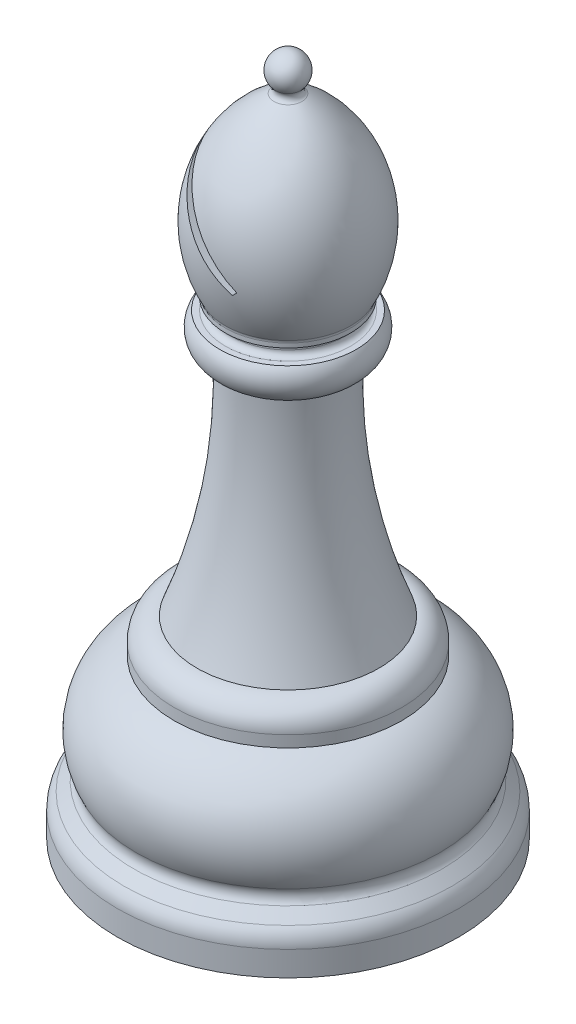
ISO-10303-21;
HEADER;
FILE_DESCRIPTION(('STEP AP214'),'2;1');
FILE_NAME('part.step','',(''),(''),'','','');
FILE_SCHEMA(('AUTOMOTIVE_DESIGN { 1 0 10303 214 1 1 1 1 }'));
ENDSEC;
DATA;
#1=APPLICATION_CONTEXT('core data for automotive mechanical design processes');
#2=APPLICATION_PROTOCOL_DEFINITION('international standard','automotive_design',2000,#1);
#3=PRODUCT_CONTEXT('',#1,'mechanical');
#4=PRODUCT('Part','Part','',(#3));
#5=PRODUCT_RELATED_PRODUCT_CATEGORY('part','',(#4));
#6=PRODUCT_DEFINITION_FORMATION('','',#4);
#7=PRODUCT_DEFINITION_CONTEXT('part definition',#1,'design');
#8=PRODUCT_DEFINITION('design','',#6,#7);
#9=PRODUCT_DEFINITION_SHAPE('','',#8);
#10=(LENGTH_UNIT() NAMED_UNIT(*) SI_UNIT(.MILLI.,.METRE.));
#11=(NAMED_UNIT(*) PLANE_ANGLE_UNIT() SI_UNIT($,.RADIAN.));
#12=(NAMED_UNIT(*) SI_UNIT($,.STERADIAN.) SOLID_ANGLE_UNIT());
#13=UNCERTAINTY_MEASURE_WITH_UNIT(LENGTH_MEASURE(1.E-05),#10,'distance_accuracy_value','');
#14=(GEOMETRIC_REPRESENTATION_CONTEXT(3) GLOBAL_UNCERTAINTY_ASSIGNED_CONTEXT((#13)) GLOBAL_UNIT_ASSIGNED_CONTEXT((#10,
#11,#12)) REPRESENTATION_CONTEXT('',''));
#15=CARTESIAN_POINT('',(0.,0.,0.));
#16=DIRECTION('',(0.,0.,1.));
#17=DIRECTION('',(1.,0.,0.));
#18=AXIS2_PLACEMENT_3D('',#15,#16,#17);
#19=CARTESIAN_POINT('',(0.,47.0339362469062,0.));
#20=DIRECTION('',(0.,1.,0.));
#21=DIRECTION('',(-1.,0.,0.));
#22=AXIS2_PLACEMENT_3D('',#19,#20,#21);
#23=DEGENERATE_TOROIDAL_SURFACE('',#22,4.34048728023934,11.1788608374825,.F.);
#24=CARTESIAN_POINT('',(0.,56.7241639655414,0.));
#25=DIRECTION('',(0.,-1.,0.));
#26=DIRECTION('',(1.,0.,0.));
#27=AXIS2_PLACEMENT_3D('',#24,#25,#26);
#28=CIRCLE('',#27,1.23323825882282);
#29=CARTESIAN_POINT('',(1.23323825882276,56.7241639655414,0.));
#30=VERTEX_POINT('',#29);
#31=EDGE_CURVE('E171',#30,#30,#28,.T.);
#32=ORIENTED_EDGE('',*,*,#31,.T.);
#33=EDGE_LOOP('',(#32));
#34=FACE_BOUND('',#33,.T.);
#35=CARTESIAN_POINT('',(0.,41.8377109987457,0.));
#36=DIRECTION('',(0.,1.,0.));
#37=DIRECTION('',(-1.,0.,0.));
#38=AXIS2_PLACEMENT_3D('',#35,#36,#37);
#39=CIRCLE('',#38,5.55729897700933);
#40=CARTESIAN_POINT('',(-5.55729897700938,41.8377109987457,0.));
#41=VERTEX_POINT('',#40);
#42=EDGE_CURVE('E174',#41,#41,#39,.T.);
#43=ORIENTED_EDGE('',*,*,#42,.T.);
#44=EDGE_LOOP('',(#43));
#45=FACE_BOUND('',#44,.T.);
#46=CARTESIAN_POINT('',(1.64275083167959,45.4222859188392,-6.51775398240126));
#47=CARTESIAN_POINT('',(1.54350520382158,45.4913393907475,-6.55314277290175));
#48=CARTESIAN_POINT('',(1.44402714878169,45.5615428418492,-6.58555057673839));
#49=CARTESIAN_POINT('',(1.24487757671969,45.7041255907972,-6.64440803459074));
#50=CARTESIAN_POINT('',(1.14520607249003,45.7765047490653,-6.67085806989428));
#51=CARTESIAN_POINT('',(0.84642782291826,45.9966310719432,-6.74125084270058));
#52=CARTESIAN_POINT('',(0.647418630164408,46.1474634190554,-6.77628542334018));
#53=CARTESIAN_POINT('',(0.252909735578571,46.455232765128,-6.82263017668789));
#54=CARTESIAN_POINT('',(0.0573982346028076,46.6121390804039,-6.83404689644883));
#55=CARTESIAN_POINT('',(-0.329183470627615,46.9313162457269,-6.83384712499839));
#56=CARTESIAN_POINT('',(-0.520253875207811,47.0935868530027,-6.82223167475218));
#57=CARTESIAN_POINT('',(-0.870185886394232,47.399165206761,-6.77963094117064));
#58=CARTESIAN_POINT('',(-1.0298399822959,47.5419824957957,-6.75155474925886));
#59=CARTESIAN_POINT('',(-1.34375580040717,47.8294774316792,-6.67902564902212));
#60=CARTESIAN_POINT('',(-1.49801589094728,47.9741556236489,-6.63456783143573));
#61=CARTESIAN_POINT('',(-1.80028731528978,48.2642495698228,-6.52966318444163));
#62=CARTESIAN_POINT('',(-1.94829831784272,48.4096653626689,-6.46921550867996));
#63=CARTESIAN_POINT('',(-2.23741334650427,48.7001454460949,-6.33271778315066));
#64=CARTESIAN_POINT('',(-2.37851494282877,48.8452095962098,-6.25666229280595));
#65=CARTESIAN_POINT('',(-2.6609421427753,49.1419449128675,-6.08462601453884));
#66=CARTESIAN_POINT('',(-2.80182605614423,49.2935238543146,-5.98775942449053));
#67=CARTESIAN_POINT('',(-3.0745581646986,49.5935048555532,-5.77752563363795));
#68=CARTESIAN_POINT('',(-3.20640185519039,49.7419053065567,-5.66415029324836));
#69=CARTESIAN_POINT('',(-3.46047473161857,50.0339712168694,-5.42136077146779));
#70=CARTESIAN_POINT('',(-3.58269792961747,50.1776336953791,-5.29193672817178));
#71=CARTESIAN_POINT('',(-3.81687346144955,50.4584224654936,-5.01763502362726));
#72=CARTESIAN_POINT('',(-3.92882652443408,50.5955492207842,-4.87275846104702));
#73=CARTESIAN_POINT('',(-4.14178196196317,50.8612784639509,-4.56829078800095));
#74=CARTESIAN_POINT('',(-4.24279734531336,50.9898910058808,-4.40871758477942));
#75=CARTESIAN_POINT('',(-4.43344614036247,51.2367832870279,-4.07533817250419));
#76=CARTESIAN_POINT('',(-4.5230784035868,51.3550619832597,-3.90153053020372));
#77=CARTESIAN_POINT('',(-4.69014584851326,51.5788932631048,-3.54082068042654));
#78=CARTESIAN_POINT('',(-4.76760130919232,51.6844669351017,-3.35394100935809));
#79=CARTESIAN_POINT('',(-4.90974056689034,51.8807456475086,-2.96794205121232));
#80=CARTESIAN_POINT('',(-4.97442967952077,51.9714568736142,-2.76882790376676));
#81=CARTESIAN_POINT('',(-5.07420058209377,52.1128496316507,-2.41654388684069));
#82=CARTESIAN_POINT('',(-5.11251960077087,52.1676584380941,-2.26593012141703));
#83=CARTESIAN_POINT('',(-5.18177309041636,52.2673552636766,-1.95981294913029));
#84=CARTESIAN_POINT('',(-5.21270925758659,52.3122455614058,-1.80431067470608));
#85=CARTESIAN_POINT('',(-5.26688930730343,52.3912518272114,-1.48941060668164));
#86=CARTESIAN_POINT('',(-5.29013949172881,52.4253766210684,-1.33001612011858));
#87=CARTESIAN_POINT('',(-5.32873365414584,52.4822079989348,-1.00824529081311));
#88=CARTESIAN_POINT('',(-5.34407739686183,52.5049142431566,-0.845868859484471));
#89=CARTESIAN_POINT('',(-5.36671361981774,52.538464401127,-0.518754674074483));
#90=CARTESIAN_POINT('',(-5.3739777416556,52.5492665317952,-0.354010645822574));
#91=CARTESIAN_POINT('',(-5.38026561610595,52.5586149620069,-0.0240171019819748));
#92=CARTESIAN_POINT('',(-5.37928940419527,52.5571613143148,0.141232411427406));
#93=CARTESIAN_POINT('',(-5.36910842492809,52.5420311630325,0.470942013410778));
#94=CARTESIAN_POINT('',(-5.35990221857308,52.5283525219259,0.63540195887441));
#95=CARTESIAN_POINT('',(-5.333376205393,52.4890858223119,0.962221988366987));
#96=CARTESIAN_POINT('',(-5.31605651514811,52.4634979349248,1.12458210253333));
#97=CARTESIAN_POINT('',(-5.27458345547823,52.402553344022,1.43789830434329));
#98=CARTESIAN_POINT('',(-5.25082039057807,52.3677567097115,1.5890156324525));
#99=CARTESIAN_POINT('',(-5.1963910361354,52.2885664181312,1.8874641219084));
#100=CARTESIAN_POINT('',(-5.16572238146366,52.2441694730111,2.03479396675395));
#101=CARTESIAN_POINT('',(-5.06373780462338,52.0976616314447,2.46988319093749));
#102=CARTESIAN_POINT('',(-4.98241628902119,51.982193196504,2.75094352072572));
#103=CARTESIAN_POINT('',(-4.78602763709677,51.7091984700646,3.31694059862163));
#104=CARTESIAN_POINT('',(-4.66841582354192,51.548639185508,3.59950381827569));
#105=CARTESIAN_POINT('',(-4.40611679977989,51.2003261308351,4.13358775272274));
#106=CARTESIAN_POINT('',(-4.26141510683791,51.0125578264798,4.38509174277152));
#107=CARTESIAN_POINT('',(-3.92069783264211,50.5838500862356,4.89388514399825));
#108=CARTESIAN_POINT('',(-3.72014639580378,50.3392745288368,5.14507153229908));
#109=CARTESIAN_POINT('',(-3.28793843369713,49.8326700907434,5.59865468161625));
#110=CARTESIAN_POINT('',(-3.05626634824615,49.5706325123597,5.80102689333813));
#111=CARTESIAN_POINT('',(-2.67363340492946,49.1555798356153,6.07611014356339));
#112=CARTESIAN_POINT('',(-2.53209661028202,49.005409523986,6.16665924993204));
#113=CARTESIAN_POINT('',(-2.24100632643523,48.7037628613001,6.33112519046148));
#114=CARTESIAN_POINT('',(-2.09145513074041,48.5522868941897,6.4050467518344));
#115=CARTESIAN_POINT('',(-1.78489632015748,48.2491927464058,6.53585991655204));
#116=CARTESIAN_POINT('',(-1.62788115672819,48.0975745805988,6.59273383549923));
#117=CARTESIAN_POINT('',(-1.30743297040636,47.7956674456754,6.68887971420346));
#118=CARTESIAN_POINT('',(-1.14400251663169,47.6453779734145,6.72815864353023));
#119=CARTESIAN_POINT('',(-0.808025051066692,47.3440373532916,6.7893729006496));
#120=CARTESIAN_POINT('',(-0.635357177358705,47.1930404194929,6.81091346679482));
#121=CARTESIAN_POINT('',(-0.285530748201392,46.894910666902,6.83478660544716));
#122=CARTESIAN_POINT('',(-0.108374102144641,46.7477762575841,6.83712721190237));
#123=CARTESIAN_POINT('',(0.248805472264024,46.4587239418775,6.82229890813946));
#124=CARTESIAN_POINT('',(0.428822535951732,46.3167969473255,6.80516583719015));
#125=CARTESIAN_POINT('',(0.790437474630042,46.0389991597626,6.75121282135805));
#126=CARTESIAN_POINT('',(0.972034200496605,45.9031243433007,6.71440617352806));
#127=CARTESIAN_POINT('',(1.23526738505126,45.7111826761685,6.64671452420833));
#128=CARTESIAN_POINT('',(1.31695734848103,45.6523177362161,6.62370372987159));
#129=CARTESIAN_POINT('',(1.48006728949212,45.5361415701742,6.57370936195279));
#130=CARTESIAN_POINT('',(1.5614874744675,45.4788285441268,6.54673064667783));
#131=CARTESIAN_POINT('',(1.64275083167959,45.4222859188392,6.51775398240129));
#132=B_SPLINE_CURVE_WITH_KNOTS('',3,(#46,#47,#48,#49,#50,#51,#52,#53,#54,#55,#56,#57,#58,#59,
#60,#61,#62,#63,#64,#65,#66,#67,#68,#69,#70,#71,#72,#73,#74,#75,#76,#77,#78,#79,#80,#81,#82,#83,
#84,#85,#86,#87,#88,#89,#90,#91,#92,#93,#94,#95,#96,#97,#98,#99,#100,#101,#102,#103,#104,#105,
#106,#107,#108,#109,#110,#111,#112,#113,#114,#115,#116,#117,#118,#119,#120,#121,#122,#123,#124,
#125,#126,#127,#128,#129,#130,#131),.UNSPECIFIED.,.F.,.F.,(4,2,2,2,2,2,2,2,2,2,2,2,2,2,2,2,2,2,
2,2,2,2,2,2,2,2,2,2,2,2,2,2,2,2,2,2,2,2,2,2,2,2,4),(0.,0.377847021021838,0.755669853553151,
1.51079022615261,2.26249653528792,3.01416887097477,3.66161615717622,4.30925762901949,
4.9569333878243,5.60483529831716,6.28950466396162,6.97451275386982,7.65994388588377,
8.34532631644877,9.02988441502095,9.71451152578168,10.3979861114937,11.0811755110015,
11.5750700894328,12.0688510866639,12.5622262137572,13.0556160215958,13.5507321508553,
14.0458461485091,14.5410467328176,15.0362402019576,15.5063667481379,15.9766545558381,
16.9166157078482,17.9496805961721,18.9832993648887,20.1902575580997,21.3978214868535,
22.0732221435495,22.7484305404163,23.4243369608,24.0999754099201,24.7902720011816,
25.4802797329814,26.1690196309577,26.8572946083048,27.1670760650683,27.4764813364249),.UNSPECIFIED.);
#133=CARTESIAN_POINT('',(1.64255083167959,45.4224250805507,-6.51782529528874));
#134=VERTEX_POINT('',#133);
#135=CARTESIAN_POINT('',(1.64255083167959,45.4224250805507,6.51782529528864));
#136=VERTEX_POINT('',#135);
#137=EDGE_CURVE('E11',#134,#136,#132,.T.);
#138=ORIENTED_EDGE('',*,*,#137,.F.);
#139=CARTESIAN_POINT('',(1.9727848952042,45.7526591440753,-6.47065151071755));
#140=CARTESIAN_POINT('',(1.91787318079421,45.6977474296653,-6.48076639843469));
#141=CARTESIAN_POINT('',(1.86288115609061,45.6427554049617,-6.48975668640327));
#142=CARTESIAN_POINT('',(1.75273646830097,45.5326107171721,-6.50548806538491));
#143=CARTESIAN_POINT('',(1.69758380516304,45.4774580540342,-6.5122291556712));
#144=CARTESIAN_POINT('',(1.64235083167959,45.4222250805507,-6.51784564548215));
#145=B_SPLINE_CURVE_WITH_KNOTS('',3,(#139,#140,#141,#142,#143,#144),.UNSPECIFIED.,.F.,.F.,(4,2,
4),(0.,0.234865147601468,0.469730371093445),.UNSPECIFIED.);
#146=CARTESIAN_POINT('',(1.9725848952042,45.7524591440753,-6.47068835813149));
#147=VERTEX_POINT('',#146);
#148=EDGE_CURVE('E57',#147,#134,#145,.T.);
#149=ORIENTED_EDGE('',*,*,#148,.F.);
#150=CARTESIAN_POINT('',(2.17981256273783,45.5450644143649,6.37648723000564));
#151=CARTESIAN_POINT('',(2.01027223386953,45.7147414227448,6.45855821528996));
#152=CARTESIAN_POINT('',(1.83805892394629,45.8870935670755,6.52947529819207));
#153=CARTESIAN_POINT('',(1.48980241581906,46.2356308315854,6.6488031474266));
#154=CARTESIAN_POINT('',(1.3137597667819,46.411815402155,6.69721711895168));
#155=CARTESIAN_POINT('',(0.959495751358652,46.766365017075,6.7713251831568));
#156=CARTESIAN_POINT('',(0.781276840457467,46.944727603961,6.79704284513454));
#157=CARTESIAN_POINT('',(0.42393066364665,47.3023618650361,6.82577767498691));
#158=CARTESIAN_POINT('',(0.244803428872721,47.4816335080646,6.82879561577339));
#159=CARTESIAN_POINT('',(-0.100540733289076,47.8272560787428,6.81272838602832));
#160=CARTESIAN_POINT('',(-0.266793821336121,47.9936431962035,6.79515730675602));
#161=CARTESIAN_POINT('',(-0.597744542382383,48.3248607221051,6.74044033550918));
#162=CARTESIAN_POINT('',(-0.762441632488526,48.4896905872152,6.70328785088866));
#163=CARTESIAN_POINT('',(-1.08898146695766,48.8164936705845,6.60957383835993));
#164=CARTESIAN_POINT('',(-1.25082541495864,48.9784680934519,6.55302071139008));
#165=CARTESIAN_POINT('',(-1.57060395721277,49.2985044338079,6.42069840494761));
#166=CARTESIAN_POINT('',(-1.72853722186579,49.4565650206245,6.34492278583468));
#167=CARTESIAN_POINT('',(-2.03968288181425,49.7679615190438,6.17420749905004));
#168=CARTESIAN_POINT('',(-2.19288004792229,49.9212821891818,6.07921219468278));
#169=CARTESIAN_POINT('',(-2.49281207999512,50.2214560195567,5.87057276595724));
#170=CARTESIAN_POINT('',(-2.63954663278369,50.368308866365,5.75692773909767));
#171=CARTESIAN_POINT('',(-2.92528334136635,50.6542759293066,5.51143153835509));
#172=CARTESIAN_POINT('',(-3.0642826923837,50.7933873384021,5.37957382013854));
#173=CARTESIAN_POINT('',(-3.33304785855904,51.0623691768695,5.09836045809221));
#174=CARTESIAN_POINT('',(-3.46281844771818,51.1922443840913,4.94901396852828));
#175=CARTESIAN_POINT('',(-3.70448995095463,51.4341107173322,4.64275134655046));
#176=CARTESIAN_POINT('',(-3.81699162725574,51.5467030898958,4.48678446640958));
#177=CARTESIAN_POINT('',(-4.03127208242003,51.7611562930319,4.1608674543408));
#178=CARTESIAN_POINT('',(-4.13305663355905,51.8630229005338,3.99092493849462));
#179=CARTESIAN_POINT('',(-4.32460780413068,52.0547284952511,3.63810162591589));
#180=CARTESIAN_POINT('',(-4.41438074523186,52.1445738092315,3.45522771301336));
#181=CARTESIAN_POINT('',(-4.58063379003861,52.3109608834171,3.07775559353585));
#182=CARTESIAN_POINT('',(-4.65711595880169,52.3875047103446,2.88315921468101));
#183=CARTESIAN_POINT('',(-4.78744337149,52.5179371899939,2.50708101226401));
#184=CARTESIAN_POINT('',(-4.8428868112888,52.573425327018,2.32670598716837));
#185=CARTESIAN_POINT('',(-4.94155327315678,52.6721713315169,1.95939224409295));
#186=CARTESIAN_POINT('',(-4.98477821960203,52.7154311249193,1.77245456493109));
#187=CARTESIAN_POINT('',(-5.0582674480173,52.7889795986594,1.39370782031171));
#188=CARTESIAN_POINT('',(-5.08854264599956,52.8192792038095,1.20190300268736));
#189=CARTESIAN_POINT('',(-5.13564023854983,52.8664147653551,0.815017487783533));
#190=CARTESIAN_POINT('',(-5.15246409541109,52.8832521852226,0.619937148940212));
#191=CARTESIAN_POINT('',(-5.17116094288173,52.9019641056614,0.251790076607897));
#192=CARTESIAN_POINT('',(-5.17457971358486,52.9053856324988,0.0788771640234944));
#193=CARTESIAN_POINT('',(-5.1706998695355,52.9015026606085,-0.266703923898891));
#194=CARTESIAN_POINT('',(-5.16340188096247,52.894198788565,-0.439372112945996));
#195=CARTESIAN_POINT('',(-5.13819895422463,52.8689755438076,-0.783120737072502));
#196=CARTESIAN_POINT('',(-5.12029555678785,52.8510577130638,-0.954201399117913));
#197=CARTESIAN_POINT('',(-5.07414190672588,52.8048668549912,-1.29354356311643));
#198=CARTESIAN_POINT('',(-5.04589151658832,52.7765936900393,-1.4618050275711));
#199=CARTESIAN_POINT('',(-4.98046410798958,52.7111135353694,-1.78917668416631));
#200=CARTESIAN_POINT('',(-4.94359094692055,52.6742106480064,-1.94840886848546));
#201=CARTESIAN_POINT('',(-4.86092552230169,52.5914785804245,-2.26222066671969));
#202=CARTESIAN_POINT('',(-4.81513036432626,52.5456465034466,-2.41679875193795));
#203=CARTESIAN_POINT('',(-4.71514535215916,52.4455808856636,-2.72037355156586));
#204=CARTESIAN_POINT('',(-4.66095722343585,52.3913490717179,-2.86937140538597));
#205=CARTESIAN_POINT('',(-4.54470519594417,52.2750033245169,-3.1611440739663));
#206=CARTESIAN_POINT('',(-4.48263830843169,52.212886400108,-3.30391649940226));
#207=CARTESIAN_POINT('',(-4.34638179762386,52.0765200424368,-3.59278508524601));
#208=CARTESIAN_POINT('',(-4.27163706920635,52.0017150565392,-3.73835784971333));
#209=CARTESIAN_POINT('',(-4.11443093639137,51.8443821877577,-4.02093739068258));
#210=CARTESIAN_POINT('',(-4.03196671117231,51.7618514817779,-4.15794100514033));
#211=CARTESIAN_POINT('',(-3.77403153781098,51.5037083670156,-4.55523356609907));
#212=CARTESIAN_POINT('',(-3.58794781881632,51.3174746316089,-4.8019515315227));
#213=CARTESIAN_POINT('',(-3.16972978523141,50.8989194402695,-5.28216945735324));
#214=CARTESIAN_POINT('',(-2.93475280287225,50.6637530248745,-5.51068341844941));
#215=CARTESIAN_POINT('',(-2.44308777020865,50.1716916231759,-5.9148328881958));
#216=CARTESIAN_POINT('',(-2.18639240065733,49.9147893117249,-6.09045047875087));
#217=CARTESIAN_POINT('',(-1.63018322063718,49.3581317286635,-6.40202654263141));
#218=CARTESIAN_POINT('',(-1.32898967198082,49.0566953646994,-6.53198301294689));
#219=CARTESIAN_POINT('',(-0.715539038738993,48.442750181674,-6.72309500232366));
#220=CARTESIAN_POINT('',(-0.403272356226228,48.1302317569478,-6.78418925146204));
#221=CARTESIAN_POINT('',(0.076606539497352,47.6499659939016,-6.82424686865106));
#222=CARTESIAN_POINT('',(0.243362161104917,47.4830759377493,-6.82829345144078));
#223=CARTESIAN_POINT('',(0.576516680762548,47.1496528365846,-6.81670753731986));
#224=CARTESIAN_POINT('',(0.742915681246989,46.9831196890552,-6.801081765262));
#225=CARTESIAN_POINT('',(1.07389800580669,46.6518705341621,-6.75022730204054));
#226=CARTESIAN_POINT('',(1.23848400466994,46.4871518498541,-6.71503307472149));
#227=CARTESIAN_POINT('',(1.56490732121545,46.1604653783426,-6.62517971948835));
#228=CARTESIAN_POINT('',(1.7267463601232,45.998495868526,-6.57053329034809));
#229=CARTESIAN_POINT('',(1.93588300388366,45.789190623616,-6.48645399499566));
#230=CARTESIAN_POINT('',(1.98498196247706,45.7400520825721,-6.46572424087508));
#231=CARTESIAN_POINT('',(2.08272917735889,45.642226066135,-6.42246053272015));
#232=CARTESIAN_POINT('',(2.13137782233028,45.5935382017456,-6.39992833633573));
#233=CARTESIAN_POINT('',(2.17981256273783,45.5450644143649,-6.37648723000564));
#234=B_SPLINE_CURVE_WITH_KNOTS('',3,(#150,#151,#152,#153,#154,#155,#156,#157,#158,#159,#160,
#161,#162,#163,#164,#165,#166,#167,#168,#169,#170,#171,#172,#173,#174,#175,#176,#177,#178,#179,
#180,#181,#182,#183,#184,#185,#186,#187,#188,#189,#190,#191,#192,#193,#194,#195,#196,#197,#198,
#199,#200,#201,#202,#203,#204,#205,#206,#207,#208,#209,#210,#211,#212,#213,#214,#215,#216,#217,
#218,#219,#220,#221,#222,#223,#224,#225,#226,#227,#228,#229,#230,#231,#232,#233),.UNSPECIFIED.,
.F.,.F.,(4,2,2,2,2,2,2,2,2,2,2,2,2,2,2,2,2,2,2,2,2,2,2,2,2,2,2,2,2,2,2,2,2,2,2,2,2,2,2,2,2,4),
(0.,0.760227484446746,1.52034665396943,2.27967553518593,3.03897856159379,3.74577256009568,
4.4528046733739,5.15953101062767,5.86649441846659,6.57553438642616,7.28460867651964,
7.99393842306455,8.70289852615459,9.37051689703309,10.0377738271984,10.704678189314,
11.3714788381468,11.9607311740241,12.5498906526502,13.1385525148597,13.7271503750233,
14.245443074534,14.7637054914456,15.281892634912,15.8000866653771,16.3022174918501,
16.8045114889405,17.306702358683,17.8090843030123,18.3482887088207,18.8876909230371,
19.965967721586,21.1713448923735,22.3771299141255,23.7079677655502,25.0399887929364,
25.7471747640902,26.4541190544417,27.1598222046595,27.8650655005563,28.0825226613113,
28.2997702951114),.UNSPECIFIED.);
#235=CARTESIAN_POINT('',(1.9725848952042,45.7524591440753,6.4706883581315));
#236=VERTEX_POINT('',#235);
#237=EDGE_CURVE('E75',#236,#147,#234,.T.);
#238=ORIENTED_EDGE('',*,*,#237,.F.);
#239=CARTESIAN_POINT('',(1.64235083167959,45.4222250805507,6.51784564548215));
#240=CARTESIAN_POINT('',(1.69758380516304,45.4774580540342,6.5122291556712));
#241=CARTESIAN_POINT('',(1.75273646830097,45.5326107171721,6.50548806538491));
#242=CARTESIAN_POINT('',(1.86288115609061,45.6427554049617,6.48975668640328));
#243=CARTESIAN_POINT('',(1.91787318079421,45.6977474296653,6.4807663984347));
#244=CARTESIAN_POINT('',(1.9727848952042,45.7526591440753,6.47065151071756));
#245=B_SPLINE_CURVE_WITH_KNOTS('',3,(#239,#240,#241,#242,#243,#244),.UNSPECIFIED.,.F.,.F.,(4,2,
4),(0.,0.234865223491978,0.469730371093445),.UNSPECIFIED.);
#246=EDGE_CURVE('E79',#136,#236,#245,.T.);
#247=ORIENTED_EDGE('',*,*,#246,.F.);
#248=EDGE_LOOP('',(#138,#149,#238,#247));
#249=FACE_BOUND('',#248,.T.);
#250=ADVANCED_FACE('F43',(#34,#45,#249),#23,.F.);
#251=CARTESIAN_POINT('',(0.,60.,0.));
#252=DIRECTION('',(0.,1.,0.));
#253=DIRECTION('',(-1.,0.,0.));
#254=AXIS2_PLACEMENT_3D('',#251,#252,#253);
#255=CYLINDRICAL_SURFACE('',#254,5.50000000000004);
#256=CARTESIAN_POINT('',(0.,41.6052979951445,0.));
#257=DIRECTION('',(0.,1.,0.));
#258=DIRECTION('',(-1.,0.,0.));
#259=AXIS2_PLACEMENT_3D('',#256,#257,#258);
#260=CIRCLE('',#259,5.50000000000004);
#261=CARTESIAN_POINT('',(-5.50000000000009,41.6052979951445,0.));
#262=VERTEX_POINT('',#261);
#263=EDGE_CURVE('E176',#262,#262,#260,.F.);
#264=ORIENTED_EDGE('',*,*,#263,.T.);
#265=EDGE_LOOP('',(#264));
#266=FACE_BOUND('',#265,.T.);
#267=CARTESIAN_POINT('',(0.,41.2299999999998,0.));
#268=DIRECTION('',(0.,1.,0.));
#269=DIRECTION('',(-1.,0.,0.));
#270=AXIS2_PLACEMENT_3D('',#267,#268,#269);
#271=CIRCLE('',#270,5.50000000000004);
#272=CARTESIAN_POINT('',(-5.50000000000009,41.2299999999998,0.));
#273=VERTEX_POINT('',#272);
#274=EDGE_CURVE('E246',#273,#273,#271,.T.);
#275=ORIENTED_EDGE('',*,*,#274,.T.);
#276=EDGE_LOOP('',(#275));
#277=FACE_BOUND('',#276,.T.);
#278=ADVANCED_FACE('F155',(#266,#277),#255,.T.);
#279=CARTESIAN_POINT('',(0.,58.5,0.));
#280=DIRECTION('',(0.,1.,0.));
#281=DIRECTION('',(1.,0.,0.));
#282=AXIS2_PLACEMENT_3D('',#279,#280,#281);
#283=SPHERICAL_SURFACE('',#282,1.5);
#284=CARTESIAN_POINT('',(0.,57.4931860952841,0.));
#285=DIRECTION('',(0.,1.,0.));
#286=DIRECTION('',(-1.,0.,0.));
#287=AXIS2_PLACEMENT_3D('',#284,#285,#286);
#288=CIRCLE('',#287,1.11190186674487);
#289=CARTESIAN_POINT('',(-1.11190186674492,57.4931860952841,0.));
#290=VERTEX_POINT('',#289);
#291=EDGE_CURVE('E80',#290,#290,#288,.T.);
#292=ORIENTED_EDGE('',*,*,#291,.T.);
#293=EDGE_LOOP('',(#292));
#294=FACE_BOUND('',#293,.T.);
#295=ADVANCED_FACE('F152',(#294),#283,.T.);
#296=CARTESIAN_POINT('',(0.,0.,0.));
#297=DIRECTION('',(0.,1.,0.));
#298=DIRECTION('',(-1.,0.,0.));
#299=AXIS2_PLACEMENT_3D('',#296,#297,#298);
#300=PLANE('',#299);
#301=CARTESIAN_POINT('',(0.,0.,0.));
#302=DIRECTION('',(0.,1.,0.));
#303=DIRECTION('',(-1.,0.,0.));
#304=AXIS2_PLACEMENT_3D('',#301,#302,#303);
#305=CIRCLE('',#304,15.0000000000001);
#306=CARTESIAN_POINT('',(-15.0000000000001,0.,0.));
#307=VERTEX_POINT('',#306);
#308=EDGE_CURVE('E219',#307,#307,#305,.T.);
#309=ORIENTED_EDGE('',*,*,#308,.F.);
#310=EDGE_LOOP('',(#309));
#311=FACE_BOUND('',#310,.T.);
#312=ADVANCED_FACE('F149',(#311),#300,.F.);
#313=CARTESIAN_POINT('',(0.,60.,0.));
#314=DIRECTION('',(0.,1.,0.));
#315=DIRECTION('',(-1.,0.,0.));
#316=AXIS2_PLACEMENT_3D('',#313,#314,#315);
#317=CYLINDRICAL_SURFACE('',#316,15.0000000000001);
#318=CARTESIAN_POINT('',(0.,2.17157287525356,0.));
#319=DIRECTION('',(0.,-1.,0.));
#320=DIRECTION('',(1.,0.,0.));
#321=AXIS2_PLACEMENT_3D('',#318,#319,#320);
#322=CIRCLE('',#321,15.0000000000001);
#323=CARTESIAN_POINT('',(15.0000000000001,2.17157287525356,0.));
#324=VERTEX_POINT('',#323);
#325=EDGE_CURVE('E214',#324,#324,#322,.T.);
#326=ORIENTED_EDGE('',*,*,#325,.T.);
#327=EDGE_LOOP('',(#326));
#328=FACE_BOUND('',#327,.T.);
#329=ORIENTED_EDGE('',*,*,#308,.T.);
#330=EDGE_LOOP('',(#329));
#331=FACE_BOUND('',#330,.T.);
#332=ADVANCED_FACE('F145',(#328,#331),#317,.T.);
#333=CARTESIAN_POINT('',(0.,4.9999999999998,0.));
#334=DIRECTION('',(0.,-1.,0.));
#335=DIRECTION('',(1.,0.,0.));
#336=AXIS2_PLACEMENT_3D('',#333,#334,#335);
#337=CONICAL_SURFACE('',#336,13.,0.785398163397449);
#338=CARTESIAN_POINT('',(0.,4.45728450339964,0.));
#339=DIRECTION('',(0.,-1.,0.));
#340=DIRECTION('',(1.,0.,0.));
#341=AXIS2_PLACEMENT_3D('',#338,#339,#340);
#342=CIRCLE('',#341,13.5427154966002);
#343=CARTESIAN_POINT('',(13.5427154966002,4.45728450339965,0.));
#344=VERTEX_POINT('',#343);
#345=EDGE_CURVE('E230',#344,#344,#342,.T.);
#346=ORIENTED_EDGE('',*,*,#345,.T.);
#347=EDGE_LOOP('',(#346));
#348=FACE_BOUND('',#347,.T.);
#349=CARTESIAN_POINT('',(0.,3.58578643762666,0.));
#350=DIRECTION('',(0.,1.,0.));
#351=DIRECTION('',(-1.,0.,0.));
#352=AXIS2_PLACEMENT_3D('',#349,#350,#351);
#353=CIRCLE('',#352,14.4142135623732);
#354=CARTESIAN_POINT('',(-14.4142135623732,3.58578643762666,0.));
#355=VERTEX_POINT('',#354);
#356=EDGE_CURVE('E217',#355,#355,#353,.T.);
#357=ORIENTED_EDGE('',*,*,#356,.T.);
#358=EDGE_LOOP('',(#357));
#359=FACE_BOUND('',#358,.T.);
#360=ADVANCED_FACE('F141',(#348,#359),#337,.T.);
#361=CARTESIAN_POINT('',(0.,8.31443143812689,0.));
#362=DIRECTION('',(0.,1.,0.));
#363=DIRECTION('',(-1.,0.,0.));
#364=AXIS2_PLACEMENT_3D('',#361,#362,#363);
#365=TOROIDAL_SURFACE('',#364,8.00000000000004,5.99878785739629);
#366=CARTESIAN_POINT('',(0.,5.61447495874868,0.));
#367=DIRECTION('',(0.,1.,0.));
#368=DIRECTION('',(-1.,0.,0.));
#369=AXIS2_PLACEMENT_3D('',#366,#367,#368);
#370=CIRCLE('',#369,13.356835891411);
#371=CARTESIAN_POINT('',(-13.3568358914111,5.61447495874868,0.));
#372=VERTEX_POINT('',#371);
#373=EDGE_CURVE('E221',#372,#372,#370,.T.);
#374=ORIENTED_EDGE('',*,*,#373,.T.);
#375=EDGE_LOOP('',(#374));
#376=FACE_BOUND('',#375,.T.);
#377=CARTESIAN_POINT('',(0.,13.9699999999998,0.));
#378=DIRECTION('',(0.,1.,0.));
#379=DIRECTION('',(-1.,0.,0.));
#380=AXIS2_PLACEMENT_3D('',#377,#378,#379);
#381=CIRCLE('',#380,10.);
#382=CARTESIAN_POINT('',(-10.0000000000001,13.9699999999998,0.));
#383=VERTEX_POINT('',#382);
#384=EDGE_CURVE('E224',#383,#383,#381,.T.);
#385=ORIENTED_EDGE('',*,*,#384,.F.);
#386=EDGE_LOOP('',(#385));
#387=FACE_BOUND('',#386,.T.);
#388=ADVANCED_FACE('F137',(#376,#387),#365,.T.);
#389=CARTESIAN_POINT('',(0.,60.,0.));
#390=DIRECTION('',(0.,1.,0.));
#391=DIRECTION('',(-1.,0.,0.));
#392=AXIS2_PLACEMENT_3D('',#389,#390,#391);
#393=CYLINDRICAL_SURFACE('',#392,10.);
#394=CARTESIAN_POINT('',(0.,14.9699999999998,0.));
#395=DIRECTION('',(0.,1.,0.));
#396=DIRECTION('',(-1.,0.,0.));
#397=AXIS2_PLACEMENT_3D('',#394,#395,#396);
#398=CIRCLE('',#397,10.);
#399=CARTESIAN_POINT('',(-10.0000000000001,14.9699999999998,0.));
#400=VERTEX_POINT('',#399);
#401=EDGE_CURVE('E260',#400,#400,#398,.T.);
#402=ORIENTED_EDGE('',*,*,#401,.F.);
#403=EDGE_LOOP('',(#402));
#404=FACE_BOUND('',#403,.T.);
#405=ORIENTED_EDGE('',*,*,#384,.T.);
#406=EDGE_LOOP('',(#405));
#407=FACE_BOUND('',#406,.T.);
#408=ADVANCED_FACE('F133',(#404,#407),#393,.T.);
#409=CARTESIAN_POINT('',(0.,14.9699999999998,0.));
#410=DIRECTION('',(0.,1.,0.));
#411=DIRECTION('',(-1.,0.,0.));
#412=AXIS2_PLACEMENT_3D('',#409,#410,#411);
#413=TOROIDAL_SURFACE('',#412,8.00000000000005,1.99999999999999);
#414=ORIENTED_EDGE('',*,*,#401,.T.);
#415=EDGE_LOOP('',(#414));
#416=FACE_BOUND('',#415,.T.);
#417=CARTESIAN_POINT('',(0.,16.9699999999998,0.));
#418=DIRECTION('',(0.,1.,0.));
#419=DIRECTION('',(-1.,0.,0.));
#420=AXIS2_PLACEMENT_3D('',#417,#418,#419);
#421=CIRCLE('',#420,8.00000000000004);
#422=CARTESIAN_POINT('',(-8.00000000000009,16.9699999999998,0.));
#423=VERTEX_POINT('',#422);
#424=EDGE_CURVE('E257',#423,#423,#421,.T.);
#425=ORIENTED_EDGE('',*,*,#424,.F.);
#426=EDGE_LOOP('',(#425));
#427=FACE_BOUND('',#426,.T.);
#428=ADVANCED_FACE('F129',(#416,#427),#413,.T.);
#429=CARTESIAN_POINT('',(0.,34.9876023847988,0.));
#430=DIRECTION('',(0.,1.,0.));
#431=DIRECTION('',(-1.,0.,0.));
#432=AXIS2_PLACEMENT_3D('',#429,#430,#431);
#433=TOROIDAL_SURFACE('',#432,54.6408190783919,50.);
#434=ORIENTED_EDGE('',*,*,#424,.T.);
#435=EDGE_LOOP('',(#434));
#436=FACE_BOUND('',#435,.T.);
#437=CARTESIAN_POINT('',(0.,36.9699999999998,0.));
#438=DIRECTION('',(0.,1.,0.));
#439=DIRECTION('',(-1.,0.,0.));
#440=AXIS2_PLACEMENT_3D('',#437,#438,#439);
#441=CIRCLE('',#440,4.68013353770661);
#442=CARTESIAN_POINT('',(-4.68013353770666,36.9699999999998,0.));
#443=VERTEX_POINT('',#442);
#444=EDGE_CURVE('E249',#443,#443,#441,.T.);
#445=ORIENTED_EDGE('',*,*,#444,.F.);
#446=EDGE_LOOP('',(#445));
#447=FACE_BOUND('',#446,.T.);
#448=ADVANCED_FACE('F125',(#436,#447),#433,.F.);
#449=CARTESIAN_POINT('',(0.,38.9575162084841,0.));
#450=DIRECTION('',(0.,1.,0.));
#451=DIRECTION('',(-1.,0.,0.));
#452=AXIS2_PLACEMENT_3D('',#449,#450,#451);
#453=TOROIDAL_SURFACE('',#452,4.45702073885303,1.99999999999999);
#454=ORIENTED_EDGE('',*,*,#444,.T.);
#455=EDGE_LOOP('',(#454));
#456=FACE_BOUND('',#455,.T.);
#457=CARTESIAN_POINT('',(0.,40.2299999999998,0.));
#458=DIRECTION('',(0.,1.,0.));
#459=DIRECTION('',(-1.,0.,0.));
#460=AXIS2_PLACEMENT_3D('',#457,#458,#459);
#461=CIRCLE('',#460,6.00000000000004);
#462=CARTESIAN_POINT('',(-6.00000000000009,40.2299999999998,0.));
#463=VERTEX_POINT('',#462);
#464=EDGE_CURVE('E245',#463,#463,#461,.T.);
#465=ORIENTED_EDGE('',*,*,#464,.F.);
#466=EDGE_LOOP('',(#465));
#467=FACE_BOUND('',#466,.T.);
#468=ADVANCED_FACE('F121',(#456,#467),#453,.T.);
#469=CARTESIAN_POINT('',(0.,40.2299999999998,0.));
#470=DIRECTION('',(0.,-1.,0.));
#471=DIRECTION('',(1.,0.,0.));
#472=AXIS2_PLACEMENT_3D('',#469,#470,#471);
#473=PLANE('',#472);
#474=CARTESIAN_POINT('',(0.,40.2299999999998,0.));
#475=DIRECTION('',(0.,-1.,0.));
#476=DIRECTION('',(1.,0.,0.));
#477=AXIS2_PLACEMENT_3D('',#474,#475,#476);
#478=CIRCLE('',#477,5.50000000000004);
#479=CARTESIAN_POINT('',(5.49999999999999,40.2299999999998,0.));
#480=VERTEX_POINT('',#479);
#481=EDGE_CURVE('E180',#480,#480,#478,.T.);
#482=ORIENTED_EDGE('',*,*,#481,.T.);
#483=EDGE_LOOP('',(#482));
#484=FACE_BOUND('',#483,.T.);
#485=ORIENTED_EDGE('',*,*,#464,.T.);
#486=EDGE_LOOP('',(#485));
#487=FACE_BOUND('',#486,.T.);
#488=ADVANCED_FACE('F117',(#484,#487),#473,.F.);
#489=CARTESIAN_POINT('',(0.,60.,0.));
#490=DIRECTION('',(0.,1.,0.));
#491=DIRECTION('',(-1.,0.,0.));
#492=AXIS2_PLACEMENT_3D('',#489,#490,#491);
#493=CYLINDRICAL_SURFACE('',#492,5.00000000000004);
#494=CARTESIAN_POINT('',(0.,40.7299999999998,0.));
#495=DIRECTION('',(0.,-1.,0.));
#496=DIRECTION('',(1.,0.,0.));
#497=AXIS2_PLACEMENT_3D('',#494,#495,#496);
#498=CIRCLE('',#497,5.00000000000004);
#499=CARTESIAN_POINT('',(4.99999999999999,40.7299999999998,0.));
#500=VERTEX_POINT('',#499);
#501=EDGE_CURVE('E233',#500,#500,#498,.F.);
#502=ORIENTED_EDGE('',*,*,#501,.T.);
#503=EDGE_LOOP('',(#502));
#504=FACE_BOUND('',#503,.T.);
#505=CARTESIAN_POINT('',(0.,41.2299999999998,0.));
#506=DIRECTION('',(0.,1.,0.));
#507=DIRECTION('',(-1.,0.,0.));
#508=AXIS2_PLACEMENT_3D('',#505,#506,#507);
#509=CIRCLE('',#508,5.00000000000004);
#510=CARTESIAN_POINT('',(-5.00000000000009,41.2299999999998,0.));
#511=VERTEX_POINT('',#510);
#512=EDGE_CURVE('E243',#511,#511,#509,.T.);
#513=ORIENTED_EDGE('',*,*,#512,.F.);
#514=EDGE_LOOP('',(#513));
#515=FACE_BOUND('',#514,.T.);
#516=ADVANCED_FACE('F113',(#504,#515),#493,.T.);
#517=CARTESIAN_POINT('',(0.,41.2299999999998,0.));
#518=DIRECTION('',(0.,1.,0.));
#519=DIRECTION('',(-1.,0.,0.));
#520=AXIS2_PLACEMENT_3D('',#517,#518,#519);
#521=PLANE('',#520);
#522=ORIENTED_EDGE('',*,*,#274,.F.);
#523=EDGE_LOOP('',(#522));
#524=FACE_BOUND('',#523,.T.);
#525=ORIENTED_EDGE('',*,*,#512,.T.);
#526=EDGE_LOOP('',(#525));
#527=FACE_BOUND('',#526,.T.);
#528=ADVANCED_FACE('F109',(#524,#527),#521,.F.);
#529=CARTESIAN_POINT('',(0.,2.17157287525356,0.));
#530=DIRECTION('',(0.,-1.,0.));
#531=DIRECTION('',(1.,0.,0.));
#532=AXIS2_PLACEMENT_3D('',#529,#530,#531);
#533=TOROIDAL_SURFACE('',#532,13.0000000000001,2.);
#534=ORIENTED_EDGE('',*,*,#325,.F.);
#535=EDGE_LOOP('',(#534));
#536=FACE_BOUND('',#535,.T.);
#537=ORIENTED_EDGE('',*,*,#356,.F.);
#538=EDGE_LOOP('',(#537));
#539=FACE_BOUND('',#538,.T.);
#540=ADVANCED_FACE('F112',(#536,#539),#533,.T.);
#541=CARTESIAN_POINT('',(0.,5.16439128458619,0.));
#542=DIRECTION('',(0.,1.,0.));
#543=DIRECTION('',(-1.,0.,0.));
#544=AXIS2_PLACEMENT_3D('',#541,#542,#543);
#545=TOROIDAL_SURFACE('',#544,14.2498222777867,1.);
#546=ORIENTED_EDGE('',*,*,#345,.F.);
#547=EDGE_LOOP('',(#546));
#548=FACE_BOUND('',#547,.T.);
#549=ORIENTED_EDGE('',*,*,#373,.F.);
#550=EDGE_LOOP('',(#549));
#551=FACE_BOUND('',#550,.T.);
#552=ADVANCED_FACE('F199',(#548,#551),#545,.F.);
#553=CARTESIAN_POINT('',(0.,40.7299999999998,0.));
#554=DIRECTION('',(0.,-1.,0.));
#555=DIRECTION('',(1.,0.,0.));
#556=AXIS2_PLACEMENT_3D('',#553,#554,#555);
#557=TOROIDAL_SURFACE('',#556,5.50000000000004,0.5);
#558=ORIENTED_EDGE('',*,*,#481,.F.);
#559=EDGE_LOOP('',(#558));
#560=FACE_BOUND('',#559,.T.);
#561=ORIENTED_EDGE('',*,*,#501,.F.);
#562=EDGE_LOOP('',(#561));
#563=FACE_BOUND('',#562,.T.);
#564=ADVANCED_FACE('F194',(#560,#563),#557,.F.);
#565=CARTESIAN_POINT('',(0.,41.6052979951445,0.));
#566=DIRECTION('',(0.,1.,0.));
#567=DIRECTION('',(-1.,0.,0.));
#568=AXIS2_PLACEMENT_3D('',#565,#566,#567);
#569=TOROIDAL_SURFACE('',#568,6.00000000000004,0.5);
#570=ORIENTED_EDGE('',*,*,#263,.F.);
#571=EDGE_LOOP('',(#570));
#572=FACE_BOUND('',#571,.T.);
#573=ORIENTED_EDGE('',*,*,#42,.F.);
#574=EDGE_LOOP('',(#573));
#575=FACE_BOUND('',#574,.T.);
#576=ADVANCED_FACE('F190',(#572,#575),#569,.F.);
#577=CARTESIAN_POINT('',(0.,57.1575814603788,0.));
#578=DIRECTION('',(0.,1.,0.));
#579=DIRECTION('',(-1.,0.,0.));
#580=AXIS2_PLACEMENT_3D('',#577,#578,#579);
#581=TOROIDAL_SURFACE('',#580,1.4825358223265,0.5);
#582=ORIENTED_EDGE('',*,*,#31,.F.);
#583=EDGE_LOOP('',(#582));
#584=FACE_BOUND('',#583,.T.);
#585=ORIENTED_EDGE('',*,*,#291,.F.);
#586=EDGE_LOOP('',(#585));
#587=FACE_BOUND('',#586,.T.);
#588=ADVANCED_FACE('F45',(#584,#587),#581,.F.);
#589=CARTESIAN_POINT('',(17.1457194317716,67.7030078920057,7.50575404907929));
#590=DIRECTION('',(0.,0.,-1.));
#591=DIRECTION('',(-1.,0.,0.));
#592=AXIS2_PLACEMENT_3D('',#589,#590,#591);
#593=CYLINDRICAL_SURFACE('',#592,27.1435555346197);
#594=ORIENTED_EDGE('',*,*,#137,.T.);
#595=DIRECTION('',(0.,0.,-1.));
#596=VECTOR('',#595,1.);
#597=CARTESIAN_POINT('',(1.64255083167959,45.4224250805507,7.50575404907929));
#598=LINE('',#597,#596);
#599=EDGE_CURVE('E83',#136,#134,#598,.T.);
#600=ORIENTED_EDGE('',*,*,#599,.T.);
#601=EDGE_LOOP('',(#594,#600));
#602=FACE_BOUND('',#601,.T.);
#603=ADVANCED_FACE('F102',(#602),#593,.F.);
#604=CARTESIAN_POINT('',(1.64255083167959,45.4224250805507,7.50575404907929));
#605=DIRECTION('',(-0.707106781186548,0.707106781186547,0.));
#606=DIRECTION('',(-0.707106781186547,-0.707106781186548,0.));
#607=AXIS2_PLACEMENT_3D('',#604,#605,#606);
#608=PLANE('',#607);
#609=ORIENTED_EDGE('',*,*,#148,.T.);
#610=ORIENTED_EDGE('',*,*,#599,.F.);
#611=ORIENTED_EDGE('',*,*,#246,.T.);
#612=DIRECTION('',(0.,0.,-1.));
#613=VECTOR('',#612,1.);
#614=CARTESIAN_POINT('',(1.9725848952042,45.7524591440753,7.50575404907929));
#615=LINE('',#614,#613);
#616=EDGE_CURVE('E63',#236,#147,#615,.T.);
#617=ORIENTED_EDGE('',*,*,#616,.T.);
#618=EDGE_LOOP('',(#609,#610,#611,#617));
#619=FACE_BOUND('',#618,.T.);
#620=ADVANCED_FACE('F82',(#619),#608,.T.);
#621=CARTESIAN_POINT('',(1.9725848952042,45.7524591440753,7.50575404907929));
#622=DIRECTION('',(-0.70739163552698,-0.70682181204775,0.));
#623=DIRECTION('',(0.70682181204775,-0.70739163552698,0.));
#624=AXIS2_PLACEMENT_3D('',#621,#622,#623);
#625=PLANE('',#624);
#626=ORIENTED_EDGE('',*,*,#237,.T.);
#627=ORIENTED_EDGE('',*,*,#616,.F.);
#628=EDGE_LOOP('',(#626,#627));
#629=FACE_BOUND('',#628,.T.);
#630=ADVANCED_FACE('F76',(#629),#625,.T.);
#631=CLOSED_SHELL('',(#250,#278,#295,#312,#332,#360,#388,#408,#428,#448,#468,#488,#516,#528,
#540,#552,#564,#576,#588,#603,#620,#630));
#632=MANIFOLD_SOLID_BREP('B2',#631);
#633=ADVANCED_BREP_SHAPE_REPRESENTATION('',(#18,#632),#14);
#634=SHAPE_DEFINITION_REPRESENTATION(#9,#633);
ENDSEC;
END-ISO-10303-21;
